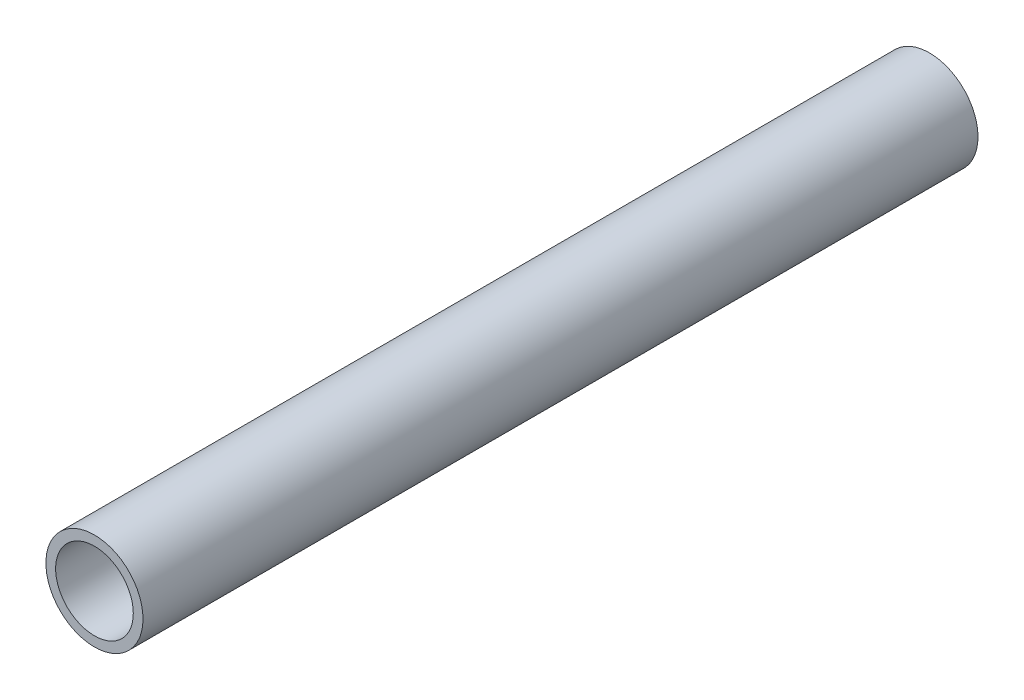
ISO-10303-21;
HEADER;
FILE_DESCRIPTION(('STEP AP214'),'2;1');
FILE_NAME('part.step','',(''),(''),'','','');
FILE_SCHEMA(('AUTOMOTIVE_DESIGN { 1 0 10303 214 1 1 1 1 }'));
ENDSEC;
DATA;
#1=APPLICATION_CONTEXT('core data for automotive mechanical design processes');
#2=APPLICATION_PROTOCOL_DEFINITION('international standard','automotive_design',2000,#1);
#3=PRODUCT_CONTEXT('',#1,'mechanical');
#4=PRODUCT('Part','Part','',(#3));
#5=PRODUCT_RELATED_PRODUCT_CATEGORY('part','',(#4));
#6=PRODUCT_DEFINITION_FORMATION('','',#4);
#7=PRODUCT_DEFINITION_CONTEXT('part definition',#1,'design');
#8=PRODUCT_DEFINITION('design','',#6,#7);
#9=PRODUCT_DEFINITION_SHAPE('','',#8);
#10=(LENGTH_UNIT() NAMED_UNIT(*) SI_UNIT(.MILLI.,.METRE.));
#11=(NAMED_UNIT(*) PLANE_ANGLE_UNIT() SI_UNIT($,.RADIAN.));
#12=(NAMED_UNIT(*) SI_UNIT($,.STERADIAN.) SOLID_ANGLE_UNIT());
#13=UNCERTAINTY_MEASURE_WITH_UNIT(LENGTH_MEASURE(1.E-05),#10,'distance_accuracy_value','');
#14=(GEOMETRIC_REPRESENTATION_CONTEXT(3) GLOBAL_UNCERTAINTY_ASSIGNED_CONTEXT((#13)) GLOBAL_UNIT_ASSIGNED_CONTEXT((#10,
#11,#12)) REPRESENTATION_CONTEXT('',''));
#15=CARTESIAN_POINT('',(0.,0.,0.));
#16=DIRECTION('',(0.,0.,1.));
#17=DIRECTION('',(1.,0.,0.));
#18=AXIS2_PLACEMENT_3D('',#15,#16,#17);
#19=CARTESIAN_POINT('',(-894.504762148457,1142.58306545253,860.));
#20=DIRECTION('',(0.,0.,1.));
#21=DIRECTION('',(1.,0.,0.));
#22=AXIS2_PLACEMENT_3D('',#19,#20,#21);
#23=PLANE('',#22);
#24=CARTESIAN_POINT('',(-894.504762148457,1142.58306545253,860.));
#25=DIRECTION('',(0.,0.,1.));
#26=DIRECTION('',(1.,0.,0.));
#27=AXIS2_PLACEMENT_3D('',#24,#25,#26);
#28=CIRCLE('',#27,50.);
#29=CARTESIAN_POINT('',(-844.504762148457,1142.58306545253,860.));
#30=VERTEX_POINT('',#29);
#31=EDGE_CURVE('E10',#30,#30,#28,.T.);
#32=ORIENTED_EDGE('',*,*,#31,.T.);
#33=EDGE_LOOP('',(#32));
#34=FACE_BOUND('',#33,.T.);
#35=CARTESIAN_POINT('',(-894.504762148457,1142.58306545253,860.));
#36=DIRECTION('',(0.,0.,1.));
#37=DIRECTION('',(1.,0.,0.));
#38=AXIS2_PLACEMENT_3D('',#35,#36,#37);
#39=CIRCLE('',#38,40.);
#40=CARTESIAN_POINT('',(-854.504762148457,1142.58306545253,860.));
#41=VERTEX_POINT('',#40);
#42=EDGE_CURVE('E50',#41,#41,#39,.T.);
#43=ORIENTED_EDGE('',*,*,#42,.F.);
#44=EDGE_LOOP('',(#43));
#45=FACE_BOUND('',#44,.T.);
#46=ADVANCED_FACE('F37',(#34,#45),#23,.T.);
#47=CARTESIAN_POINT('',(-894.504762148457,1142.58306545253,0.));
#48=DIRECTION('',(0.,0.,1.));
#49=DIRECTION('',(1.,0.,0.));
#50=AXIS2_PLACEMENT_3D('',#47,#48,#49);
#51=PLANE('',#50);
#52=CARTESIAN_POINT('',(-894.504762148457,1142.58306545253,0.));
#53=DIRECTION('',(0.,0.,1.));
#54=DIRECTION('',(1.,0.,0.));
#55=AXIS2_PLACEMENT_3D('',#52,#53,#54);
#56=CIRCLE('',#55,50.);
#57=CARTESIAN_POINT('',(-844.504762148457,1142.58306545253,0.));
#58=VERTEX_POINT('',#57);
#59=EDGE_CURVE('E41',#58,#58,#56,.T.);
#60=ORIENTED_EDGE('',*,*,#59,.F.);
#61=EDGE_LOOP('',(#60));
#62=FACE_BOUND('',#61,.T.);
#63=CARTESIAN_POINT('',(-894.504762148457,1142.58306545253,0.));
#64=DIRECTION('',(0.,0.,1.));
#65=DIRECTION('',(1.,0.,0.));
#66=AXIS2_PLACEMENT_3D('',#63,#64,#65);
#67=CIRCLE('',#66,40.);
#68=CARTESIAN_POINT('',(-854.504762148457,1142.58306545253,0.));
#69=VERTEX_POINT('',#68);
#70=EDGE_CURVE('E52',#69,#69,#67,.T.);
#71=ORIENTED_EDGE('',*,*,#70,.T.);
#72=EDGE_LOOP('',(#71));
#73=FACE_BOUND('',#72,.T.);
#74=ADVANCED_FACE('F64',(#62,#73),#51,.F.);
#75=CARTESIAN_POINT('',(-894.504762148457,1142.58306545253,860.));
#76=DIRECTION('',(0.,0.,-1.));
#77=DIRECTION('',(-1.,0.,0.));
#78=AXIS2_PLACEMENT_3D('',#75,#76,#77);
#79=CYLINDRICAL_SURFACE('',#78,50.);
#80=ORIENTED_EDGE('',*,*,#31,.F.);
#81=EDGE_LOOP('',(#80));
#82=FACE_BOUND('',#81,.T.);
#83=ORIENTED_EDGE('',*,*,#59,.T.);
#84=EDGE_LOOP('',(#83));
#85=FACE_BOUND('',#84,.T.);
#86=ADVANCED_FACE('F39',(#82,#85),#79,.T.);
#87=CARTESIAN_POINT('',(-894.504762148457,1142.58306545253,860.));
#88=DIRECTION('',(0.,0.,-1.));
#89=DIRECTION('',(-1.,0.,0.));
#90=AXIS2_PLACEMENT_3D('',#87,#88,#89);
#91=CYLINDRICAL_SURFACE('',#90,40.);
#92=ORIENTED_EDGE('',*,*,#42,.T.);
#93=EDGE_LOOP('',(#92));
#94=FACE_BOUND('',#93,.T.);
#95=ORIENTED_EDGE('',*,*,#70,.F.);
#96=EDGE_LOOP('',(#95));
#97=FACE_BOUND('',#96,.T.);
#98=ADVANCED_FACE('F60',(#94,#97),#91,.F.);
#99=CLOSED_SHELL('',(#46,#74,#86,#98));
#100=MANIFOLD_SOLID_BREP('B2',#99);
#101=ADVANCED_BREP_SHAPE_REPRESENTATION('',(#18,#100),#14);
#102=SHAPE_DEFINITION_REPRESENTATION(#9,#101);
ENDSEC;
END-ISO-10303-21;
